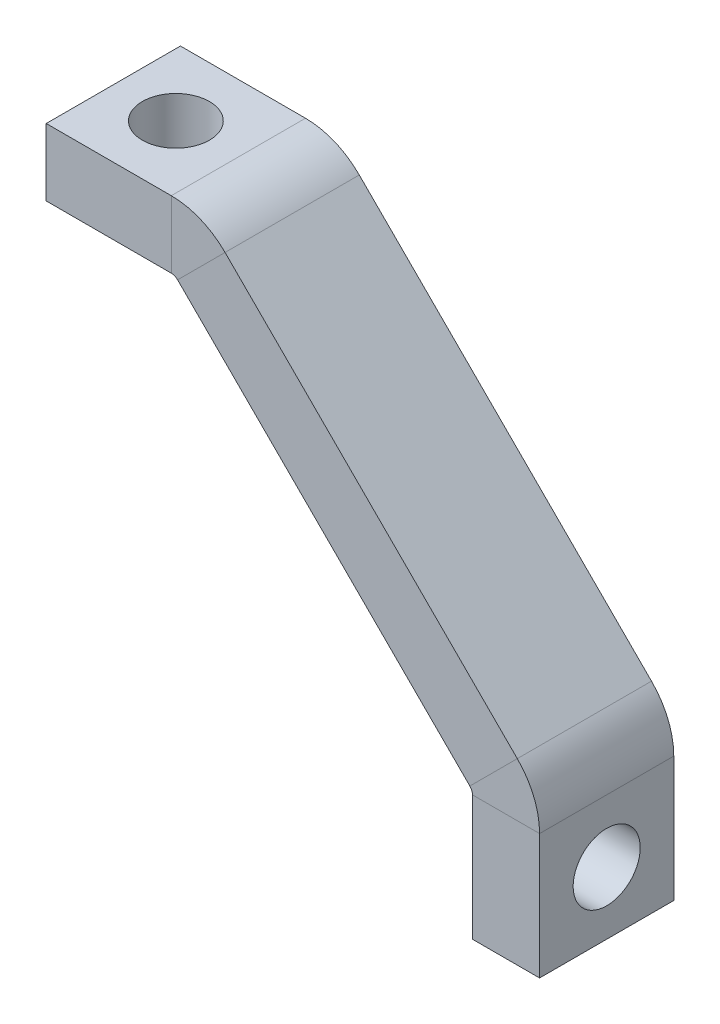
ISO-10303-21;
HEADER;
FILE_DESCRIPTION(('STEP AP214'),'2;1');
FILE_NAME('part.step','',(''),(''),'','','');
FILE_SCHEMA(('AUTOMOTIVE_DESIGN { 1 0 10303 214 1 1 1 1 }'));
ENDSEC;
DATA;
#1=APPLICATION_CONTEXT('core data for automotive mechanical design processes');
#2=APPLICATION_PROTOCOL_DEFINITION('international standard','automotive_design',2000,#1);
#3=PRODUCT_CONTEXT('',#1,'mechanical');
#4=PRODUCT('Part','Part','',(#3));
#5=PRODUCT_RELATED_PRODUCT_CATEGORY('part','',(#4));
#6=PRODUCT_DEFINITION_FORMATION('','',#4);
#7=PRODUCT_DEFINITION_CONTEXT('part definition',#1,'design');
#8=PRODUCT_DEFINITION('design','',#6,#7);
#9=PRODUCT_DEFINITION_SHAPE('','',#8);
#10=(LENGTH_UNIT() NAMED_UNIT(*) SI_UNIT(.MILLI.,.METRE.));
#11=(NAMED_UNIT(*) PLANE_ANGLE_UNIT() SI_UNIT($,.RADIAN.));
#12=(NAMED_UNIT(*) SI_UNIT($,.STERADIAN.) SOLID_ANGLE_UNIT());
#13=UNCERTAINTY_MEASURE_WITH_UNIT(LENGTH_MEASURE(1.E-05),#10,'distance_accuracy_value','');
#14=(GEOMETRIC_REPRESENTATION_CONTEXT(3) GLOBAL_UNCERTAINTY_ASSIGNED_CONTEXT((#13)) GLOBAL_UNIT_ASSIGNED_CONTEXT((#10,
#11,#12)) REPRESENTATION_CONTEXT('',''));
#15=CARTESIAN_POINT('',(0.,0.,0.));
#16=DIRECTION('',(0.,0.,1.));
#17=DIRECTION('',(1.,0.,0.));
#18=AXIS2_PLACEMENT_3D('',#15,#16,#17);
#19=CARTESIAN_POINT('',(-21.0835503941937,7.15158223835158,6.));
#20=DIRECTION('',(0.,0.,1.));
#21=DIRECTION('',(0.707106781186548,-0.707106781186547,0.));
#22=AXIS2_PLACEMENT_3D('',#19,#20,#21);
#23=PLANE('',#22);
#24=DIRECTION('',(-0.707106781186547,-0.707106781186548,0.));
#25=VECTOR('',#24,1.);
#26=CARTESIAN_POINT('',(-7.02147470229817,-6.91049345354399,6.));
#27=LINE('',#26,#25);
#28=CARTESIAN_POINT('',(-7.02147470229817,-6.91049345354399,6.));
#29=VERTEX_POINT('',#28);
#30=CARTESIAN_POINT('',(-9.14279504585781,-9.03181379710363,6.));
#31=VERTEX_POINT('',#30);
#32=EDGE_CURVE('E11',#29,#31,#27,.T.);
#33=ORIENTED_EDGE('',*,*,#32,.F.);
#34=DIRECTION('',(0.707106781186548,-0.707106781186547,0.));
#35=VECTOR('',#34,1.);
#36=CARTESIAN_POINT('',(-21.0835503941937,7.15158223835158,6.));
#37=LINE('',#36,#35);
#38=CARTESIAN_POINT('',(-20.087713450228,6.15574529438584,6.));
#39=VERTEX_POINT('',#38);
#40=EDGE_CURVE('E145',#39,#29,#37,.T.);
#41=ORIENTED_EDGE('',*,*,#40,.F.);
#42=DIRECTION('',(-0.707106781186547,-0.707106781186547,0.));
#43=VECTOR('',#42,1.);
#44=CARTESIAN_POINT('',(-20.087713450228,6.15574529438584,6.));
#45=LINE('',#44,#43);
#46=CARTESIAN_POINT('',(-22.2090337937876,4.0344249508262,6.));
#47=VERTEX_POINT('',#46);
#48=EDGE_CURVE('E49',#39,#47,#45,.T.);
#49=ORIENTED_EDGE('',*,*,#48,.T.);
#50=DIRECTION('',(-0.707106781186548,0.707106781186547,0.));
#51=VECTOR('',#50,1.);
#52=CARTESIAN_POINT('',(-23.2048707377534,5.03026189479194,6.));
#53=LINE('',#52,#51);
#54=EDGE_CURVE('E251',#47,#31,#53,.F.);
#55=ORIENTED_EDGE('',*,*,#54,.T.);
#56=EDGE_LOOP('',(#33,#41,#49,#55));
#57=FACE_BOUND('',#56,.T.);
#58=ADVANCED_FACE('F39',(#57),#23,.T.);
#59=CARTESIAN_POINT('',(-22.4918765062623,3.75158223835158,6.));
#60=DIRECTION('',(0.,0.,1.));
#61=DIRECTION('',(1.,0.,0.));
#62=AXIS2_PLACEMENT_3D('',#59,#60,#61);
#63=PLANE('',#62);
#64=ORIENTED_EDGE('',*,*,#48,.F.);
#65=CARTESIAN_POINT('',(-22.4918765062623,3.75158223835158,6.));
#66=DIRECTION('',(0.,0.,-1.));
#67=DIRECTION('',(-1.,0.,0.));
#68=AXIS2_PLACEMENT_3D('',#65,#66,#67);
#69=CIRCLE('',#68,3.4);
#70=CARTESIAN_POINT('',(-22.4918765062623,7.15158223835158,6.));
#71=VERTEX_POINT('',#70);
#72=EDGE_CURVE('E160',#39,#71,#69,.F.);
#73=ORIENTED_EDGE('',*,*,#72,.T.);
#74=DIRECTION('',(0.,-1.,0.));
#75=VECTOR('',#74,1.);
#76=CARTESIAN_POINT('',(-22.4918765062623,7.15158223835158,6.));
#77=LINE('',#76,#75);
#78=CARTESIAN_POINT('',(-22.4918765062623,4.15158223835158,6.));
#79=VERTEX_POINT('',#78);
#80=EDGE_CURVE('E211',#71,#79,#77,.T.);
#81=ORIENTED_EDGE('',*,*,#80,.T.);
#82=CARTESIAN_POINT('',(-22.4918765062623,3.75158223835158,6.));
#83=DIRECTION('',(0.,0.,1.));
#84=DIRECTION('',(1.,0.,0.));
#85=AXIS2_PLACEMENT_3D('',#82,#83,#84);
#86=CIRCLE('',#85,0.4);
#87=EDGE_CURVE('E252',#47,#79,#86,.T.);
#88=ORIENTED_EDGE('',*,*,#87,.F.);
#89=EDGE_LOOP('',(#64,#73,#81,#88));
#90=FACE_BOUND('',#89,.T.);
#91=ADVANCED_FACE('F298',(#90),#63,.T.);
#92=CARTESIAN_POINT('',(-28.0835503941937,7.15158223835158,6.));
#93=DIRECTION('',(0.,0.,1.));
#94=DIRECTION('',(1.,0.,0.));
#95=AXIS2_PLACEMENT_3D('',#92,#93,#94);
#96=PLANE('',#95);
#97=ORIENTED_EDGE('',*,*,#80,.F.);
#98=DIRECTION('',(1.,0.,0.));
#99=VECTOR('',#98,1.);
#100=CARTESIAN_POINT('',(-28.0835503941937,7.15158223835158,6.));
#101=LINE('',#100,#99);
#102=CARTESIAN_POINT('',(-28.0835503941937,7.15158223835158,6.));
#103=VERTEX_POINT('',#102);
#104=EDGE_CURVE('E173',#103,#71,#101,.T.);
#105=ORIENTED_EDGE('',*,*,#104,.F.);
#106=DIRECTION('',(0.,-1.,0.));
#107=VECTOR('',#106,1.);
#108=CARTESIAN_POINT('',(-28.0835503941937,7.15158223835158,6.));
#109=LINE('',#108,#107);
#110=CARTESIAN_POINT('',(-28.0835503941937,4.15158223835158,6.));
#111=VERTEX_POINT('',#110);
#112=EDGE_CURVE('E209',#103,#111,#109,.T.);
#113=ORIENTED_EDGE('',*,*,#112,.T.);
#114=DIRECTION('',(1.,0.,0.));
#115=VECTOR('',#114,1.);
#116=CARTESIAN_POINT('',(-28.0835503941937,4.15158223835158,6.));
#117=LINE('',#116,#115);
#118=EDGE_CURVE('E259',#111,#79,#117,.T.);
#119=ORIENTED_EDGE('',*,*,#118,.T.);
#120=EDGE_LOOP('',(#97,#105,#113,#119));
#121=FACE_BOUND('',#120,.T.);
#122=ADVANCED_FACE('F302',(#121),#96,.T.);
#123=CARTESIAN_POINT('',(-28.0835503941937,7.15158223835158,6.));
#124=DIRECTION('',(1.,0.,0.));
#125=DIRECTION('',(0.,0.,-1.));
#126=AXIS2_PLACEMENT_3D('',#123,#124,#125);
#127=PLANE('',#126);
#128=ORIENTED_EDGE('',*,*,#112,.F.);
#129=DIRECTION('',(0.,0.,-1.));
#130=VECTOR('',#129,1.);
#131=CARTESIAN_POINT('',(-28.0835503941937,7.15158223835158,6.));
#132=LINE('',#131,#130);
#133=CARTESIAN_POINT('',(-28.0835503941937,7.15158223835158,0.));
#134=VERTEX_POINT('',#133);
#135=EDGE_CURVE('E176',#103,#134,#132,.T.);
#136=ORIENTED_EDGE('',*,*,#135,.T.);
#137=DIRECTION('',(0.,-1.,0.));
#138=VECTOR('',#137,1.);
#139=CARTESIAN_POINT('',(-28.0835503941937,7.15158223835158,0.));
#140=LINE('',#139,#138);
#141=CARTESIAN_POINT('',(-28.0835503941937,4.15158223835158,0.));
#142=VERTEX_POINT('',#141);
#143=EDGE_CURVE('E207',#134,#142,#140,.T.);
#144=ORIENTED_EDGE('',*,*,#143,.T.);
#145=DIRECTION('',(0.,0.,1.));
#146=VECTOR('',#145,1.);
#147=CARTESIAN_POINT('',(-28.0835503941937,4.15158223835158,6.));
#148=LINE('',#147,#146);
#149=EDGE_CURVE('E247',#111,#142,#148,.F.);
#150=ORIENTED_EDGE('',*,*,#149,.F.);
#151=EDGE_LOOP('',(#128,#136,#144,#150));
#152=FACE_BOUND('',#151,.T.);
#153=ADVANCED_FACE('F308',(#152),#127,.F.);
#154=CARTESIAN_POINT('',(-28.0835503941937,7.15158223835158,0.));
#155=DIRECTION('',(0.,0.,1.));
#156=DIRECTION('',(1.,0.,0.));
#157=AXIS2_PLACEMENT_3D('',#154,#155,#156);
#158=PLANE('',#157);
#159=ORIENTED_EDGE('',*,*,#143,.F.);
#160=DIRECTION('',(1.,0.,0.));
#161=VECTOR('',#160,1.);
#162=CARTESIAN_POINT('',(-28.0835503941937,7.15158223835158,0.));
#163=LINE('',#162,#161);
#164=CARTESIAN_POINT('',(-22.4918765062623,7.15158223835158,0.));
#165=VERTEX_POINT('',#164);
#166=EDGE_CURVE('E162',#134,#165,#163,.T.);
#167=ORIENTED_EDGE('',*,*,#166,.T.);
#168=DIRECTION('',(0.,-1.,0.));
#169=VECTOR('',#168,1.);
#170=CARTESIAN_POINT('',(-22.4918765062623,7.15158223835158,0.));
#171=LINE('',#170,#169);
#172=CARTESIAN_POINT('',(-22.4918765062623,4.15158223835158,0.));
#173=VERTEX_POINT('',#172);
#174=EDGE_CURVE('E205',#165,#173,#171,.T.);
#175=ORIENTED_EDGE('',*,*,#174,.T.);
#176=DIRECTION('',(1.,0.,0.));
#177=VECTOR('',#176,1.);
#178=CARTESIAN_POINT('',(-28.0835503941937,4.15158223835158,0.));
#179=LINE('',#178,#177);
#180=EDGE_CURVE('E256',#142,#173,#179,.T.);
#181=ORIENTED_EDGE('',*,*,#180,.F.);
#182=EDGE_LOOP('',(#159,#167,#175,#181));
#183=FACE_BOUND('',#182,.T.);
#184=ADVANCED_FACE('F312',(#183),#158,.F.);
#185=CARTESIAN_POINT('',(-22.4918765062623,3.75158223835158,0.));
#186=DIRECTION('',(0.,0.,-1.));
#187=DIRECTION('',(-1.,0.,0.));
#188=AXIS2_PLACEMENT_3D('',#185,#186,#187);
#189=PLANE('',#188);
#190=ORIENTED_EDGE('',*,*,#174,.F.);
#191=CARTESIAN_POINT('',(-22.4918765062623,3.75158223835158,0.));
#192=DIRECTION('',(0.,0.,1.));
#193=DIRECTION('',(1.,0.,0.));
#194=AXIS2_PLACEMENT_3D('',#191,#192,#193);
#195=CIRCLE('',#194,3.4);
#196=CARTESIAN_POINT('',(-20.087713450228,6.15574529438584,0.));
#197=VERTEX_POINT('',#196);
#198=EDGE_CURVE('E165',#165,#197,#195,.F.);
#199=ORIENTED_EDGE('',*,*,#198,.T.);
#200=DIRECTION('',(-0.707106781186547,-0.707106781186548,0.));
#201=VECTOR('',#200,1.);
#202=CARTESIAN_POINT('',(-20.087713450228,6.15574529438584,0.));
#203=LINE('',#202,#201);
#204=CARTESIAN_POINT('',(-22.2090337937876,4.0344249508262,0.));
#205=VERTEX_POINT('',#204);
#206=EDGE_CURVE('E134',#197,#205,#203,.T.);
#207=ORIENTED_EDGE('',*,*,#206,.T.);
#208=CARTESIAN_POINT('',(-22.4918765062623,3.75158223835158,0.));
#209=DIRECTION('',(0.,0.,1.));
#210=DIRECTION('',(1.,0.,0.));
#211=AXIS2_PLACEMENT_3D('',#208,#209,#210);
#212=CIRCLE('',#211,0.4);
#213=EDGE_CURVE('E253',#173,#205,#212,.F.);
#214=ORIENTED_EDGE('',*,*,#213,.F.);
#215=EDGE_LOOP('',(#190,#199,#207,#214));
#216=FACE_BOUND('',#215,.T.);
#217=ADVANCED_FACE('F316',(#216),#189,.T.);
#218=CARTESIAN_POINT('',(-21.0835503941937,7.15158223835158,0.));
#219=DIRECTION('',(0.,0.,1.));
#220=DIRECTION('',(0.707106781186548,-0.707106781186547,0.));
#221=AXIS2_PLACEMENT_3D('',#218,#219,#220);
#222=PLANE('',#221);
#223=ORIENTED_EDGE('',*,*,#206,.F.);
#224=DIRECTION('',(0.707106781186548,-0.707106781186547,0.));
#225=VECTOR('',#224,1.);
#226=CARTESIAN_POINT('',(-21.0835503941937,7.15158223835158,0.));
#227=LINE('',#226,#225);
#228=CARTESIAN_POINT('',(-7.02147470229817,-6.91049345354399,0.));
#229=VERTEX_POINT('',#228);
#230=EDGE_CURVE('E143',#197,#229,#227,.T.);
#231=ORIENTED_EDGE('',*,*,#230,.T.);
#232=DIRECTION('',(-0.707106781186547,-0.707106781186547,0.));
#233=VECTOR('',#232,1.);
#234=CARTESIAN_POINT('',(-7.02147470229817,-6.91049345354399,0.));
#235=LINE('',#234,#233);
#236=CARTESIAN_POINT('',(-9.14279504585781,-9.03181379710363,0.));
#237=VERTEX_POINT('',#236);
#238=EDGE_CURVE('E58',#229,#237,#235,.T.);
#239=ORIENTED_EDGE('',*,*,#238,.T.);
#240=DIRECTION('',(-0.707106781186548,0.707106781186547,0.));
#241=VECTOR('',#240,1.);
#242=CARTESIAN_POINT('',(-23.2048707377534,5.03026189479194,0.));
#243=LINE('',#242,#241);
#244=EDGE_CURVE('E249',#205,#237,#243,.F.);
#245=ORIENTED_EDGE('',*,*,#244,.F.);
#246=EDGE_LOOP('',(#223,#231,#239,#245));
#247=FACE_BOUND('',#246,.T.);
#248=ADVANCED_FACE('F158',(#247),#222,.F.);
#249=CARTESIAN_POINT('',(-9.42563775833243,-9.31465650957825,0.));
#250=DIRECTION('',(0.,0.,-1.));
#251=DIRECTION('',(-1.,0.,0.));
#252=AXIS2_PLACEMENT_3D('',#249,#250,#251);
#253=PLANE('',#252);
#254=ORIENTED_EDGE('',*,*,#238,.F.);
#255=CARTESIAN_POINT('',(-9.42563775833243,-9.31465650957825,0.));
#256=DIRECTION('',(0.,0.,1.));
#257=DIRECTION('',(1.,0.,0.));
#258=AXIS2_PLACEMENT_3D('',#255,#256,#257);
#259=CIRCLE('',#258,3.4);
#260=CARTESIAN_POINT('',(-6.02563775833243,-9.31465650957825,0.));
#261=VERTEX_POINT('',#260);
#262=EDGE_CURVE('E130',#229,#261,#259,.F.);
#263=ORIENTED_EDGE('',*,*,#262,.T.);
#264=DIRECTION('',(-1.,0.,0.));
#265=VECTOR('',#264,1.);
#266=CARTESIAN_POINT('',(-6.02563775833243,-9.31465650957825,0.));
#267=LINE('',#266,#265);
#268=CARTESIAN_POINT('',(-9.02563775833243,-9.31465650957825,0.));
#269=VERTEX_POINT('',#268);
#270=EDGE_CURVE('E135',#261,#269,#267,.T.);
#271=ORIENTED_EDGE('',*,*,#270,.T.);
#272=CARTESIAN_POINT('',(-9.42563775833243,-9.31465650957825,0.));
#273=DIRECTION('',(0.,0.,1.));
#274=DIRECTION('',(1.,0.,0.));
#275=AXIS2_PLACEMENT_3D('',#272,#273,#274);
#276=CIRCLE('',#275,0.4);
#277=EDGE_CURVE('E132',#237,#269,#276,.F.);
#278=ORIENTED_EDGE('',*,*,#277,.F.);
#279=EDGE_LOOP('',(#254,#263,#271,#278));
#280=FACE_BOUND('',#279,.T.);
#281=ADVANCED_FACE('F127',(#280),#253,.T.);
#282=CARTESIAN_POINT('',(-6.02563775833243,-7.90633039750973,0.));
#283=DIRECTION('',(0.,0.,1.));
#284=DIRECTION('',(0.,-1.,0.));
#285=AXIS2_PLACEMENT_3D('',#282,#283,#284);
#286=PLANE('',#285);
#287=ORIENTED_EDGE('',*,*,#270,.F.);
#288=DIRECTION('',(0.,-1.,0.));
#289=VECTOR('',#288,1.);
#290=CARTESIAN_POINT('',(-6.02563775833243,-7.90633039750973,0.));
#291=LINE('',#290,#289);
#292=CARTESIAN_POINT('',(-6.02563775833243,-14.9063303975097,0.));
#293=VERTEX_POINT('',#292);
#294=EDGE_CURVE('E179',#261,#293,#291,.T.);
#295=ORIENTED_EDGE('',*,*,#294,.T.);
#296=DIRECTION('',(-1.,0.,0.));
#297=VECTOR('',#296,1.);
#298=CARTESIAN_POINT('',(-6.02563775833243,-14.9063303975097,0.));
#299=LINE('',#298,#297);
#300=CARTESIAN_POINT('',(-9.02563775833243,-14.9063303975097,0.));
#301=VERTEX_POINT('',#300);
#302=EDGE_CURVE('E199',#293,#301,#299,.T.);
#303=ORIENTED_EDGE('',*,*,#302,.T.);
#304=DIRECTION('',(0.,1.,0.));
#305=VECTOR('',#304,1.);
#306=CARTESIAN_POINT('',(-9.02563775833243,-7.90633039750973,0.));
#307=LINE('',#306,#305);
#308=EDGE_CURVE('E244',#269,#301,#307,.F.);
#309=ORIENTED_EDGE('',*,*,#308,.F.);
#310=EDGE_LOOP('',(#287,#295,#303,#309));
#311=FACE_BOUND('',#310,.T.);
#312=ADVANCED_FACE('F287',(#311),#286,.F.);
#313=CARTESIAN_POINT('',(-6.02563775833243,-14.9063303975097,6.));
#314=DIRECTION('',(0.,-1.,0.));
#315=DIRECTION('',(0.,0.,-1.));
#316=AXIS2_PLACEMENT_3D('',#313,#314,#315);
#317=PLANE('',#316);
#318=ORIENTED_EDGE('',*,*,#302,.F.);
#319=DIRECTION('',(0.,0.,-1.));
#320=VECTOR('',#319,1.);
#321=CARTESIAN_POINT('',(-6.02563775833243,-14.9063303975097,6.));
#322=LINE('',#321,#320);
#323=CARTESIAN_POINT('',(-6.02563775833243,-14.9063303975097,6.));
#324=VERTEX_POINT('',#323);
#325=EDGE_CURVE('E182',#324,#293,#322,.T.);
#326=ORIENTED_EDGE('',*,*,#325,.F.);
#327=DIRECTION('',(-1.,0.,0.));
#328=VECTOR('',#327,1.);
#329=CARTESIAN_POINT('',(-6.02563775833243,-14.9063303975097,6.));
#330=LINE('',#329,#328);
#331=CARTESIAN_POINT('',(-9.02563775833243,-14.9063303975097,6.));
#332=VERTEX_POINT('',#331);
#333=EDGE_CURVE('E196',#324,#332,#330,.T.);
#334=ORIENTED_EDGE('',*,*,#333,.T.);
#335=DIRECTION('',(0.,0.,-1.));
#336=VECTOR('',#335,1.);
#337=CARTESIAN_POINT('',(-9.02563775833243,-14.9063303975097,6.));
#338=LINE('',#337,#336);
#339=EDGE_CURVE('E241',#332,#301,#338,.T.);
#340=ORIENTED_EDGE('',*,*,#339,.T.);
#341=EDGE_LOOP('',(#318,#326,#334,#340));
#342=FACE_BOUND('',#341,.T.);
#343=ADVANCED_FACE('F288',(#342),#317,.T.);
#344=CARTESIAN_POINT('',(-6.02563775833243,-7.90633039750973,6.));
#345=DIRECTION('',(0.,0.,1.));
#346=DIRECTION('',(0.,-1.,0.));
#347=AXIS2_PLACEMENT_3D('',#344,#345,#346);
#348=PLANE('',#347);
#349=ORIENTED_EDGE('',*,*,#333,.F.);
#350=DIRECTION('',(0.,-1.,0.));
#351=VECTOR('',#350,1.);
#352=CARTESIAN_POINT('',(-6.02563775833243,-7.90633039750973,6.));
#353=LINE('',#352,#351);
#354=CARTESIAN_POINT('',(-6.02563775833243,-9.31465650957825,6.));
#355=VERTEX_POINT('',#354);
#356=EDGE_CURVE('E185',#355,#324,#353,.T.);
#357=ORIENTED_EDGE('',*,*,#356,.F.);
#358=DIRECTION('',(-1.,0.,0.));
#359=VECTOR('',#358,1.);
#360=CARTESIAN_POINT('',(-6.02563775833243,-9.31465650957825,6.));
#361=LINE('',#360,#359);
#362=CARTESIAN_POINT('',(-9.02563775833243,-9.31465650957825,6.));
#363=VERTEX_POINT('',#362);
#364=EDGE_CURVE('E200',#355,#363,#361,.T.);
#365=ORIENTED_EDGE('',*,*,#364,.T.);
#366=DIRECTION('',(0.,1.,0.));
#367=VECTOR('',#366,1.);
#368=CARTESIAN_POINT('',(-9.02563775833243,-7.90633039750973,6.));
#369=LINE('',#368,#367);
#370=EDGE_CURVE('E236',#363,#332,#369,.F.);
#371=ORIENTED_EDGE('',*,*,#370,.T.);
#372=EDGE_LOOP('',(#349,#357,#365,#371));
#373=FACE_BOUND('',#372,.T.);
#374=ADVANCED_FACE('F281',(#373),#348,.T.);
#375=CARTESIAN_POINT('',(-9.42563775833243,-9.31465650957825,6.));
#376=DIRECTION('',(0.,0.,1.));
#377=DIRECTION('',(1.,0.,0.));
#378=AXIS2_PLACEMENT_3D('',#375,#376,#377);
#379=PLANE('',#378);
#380=CARTESIAN_POINT('',(-9.42563775833243,-9.31465650957825,6.));
#381=DIRECTION('',(0.,0.,-1.));
#382=DIRECTION('',(-1.,0.,0.));
#383=AXIS2_PLACEMENT_3D('',#380,#381,#382);
#384=CIRCLE('',#383,3.4);
#385=EDGE_CURVE('E155',#355,#29,#384,.F.);
#386=ORIENTED_EDGE('',*,*,#385,.T.);
#387=ORIENTED_EDGE('',*,*,#32,.T.);
#388=CARTESIAN_POINT('',(-9.42563775833243,-9.31465650957825,6.));
#389=DIRECTION('',(0.,0.,1.));
#390=DIRECTION('',(1.,0.,0.));
#391=AXIS2_PLACEMENT_3D('',#388,#389,#390);
#392=CIRCLE('',#391,0.4);
#393=EDGE_CURVE('E168',#363,#31,#392,.T.);
#394=ORIENTED_EDGE('',*,*,#393,.F.);
#395=ORIENTED_EDGE('',*,*,#364,.F.);
#396=EDGE_LOOP('',(#386,#387,#394,#395));
#397=FACE_BOUND('',#396,.T.);
#398=ADVANCED_FACE('F41',(#397),#379,.T.);
#399=CARTESIAN_POINT('',(-9.02563775833243,-7.90633039750973,6.));
#400=DIRECTION('',(1.,0.,0.));
#401=DIRECTION('',(0.,0.,-1.));
#402=AXIS2_PLACEMENT_3D('',#399,#400,#401);
#403=PLANE('',#402);
#404=CARTESIAN_POINT('',(-9.02563775833243,-12.110493453544,3.));
#405=DIRECTION('',(-1.,0.,0.));
#406=DIRECTION('',(0.,0.,1.));
#407=AXIS2_PLACEMENT_3D('',#404,#405,#406);
#408=CIRCLE('',#407,1.5);
#409=CARTESIAN_POINT('',(-9.02563775833243,-12.110493453544,4.5));
#410=VERTEX_POINT('',#409);
#411=EDGE_CURVE('E224',#410,#410,#408,.T.);
#412=ORIENTED_EDGE('',*,*,#411,.F.);
#413=EDGE_LOOP('',(#412));
#414=FACE_BOUND('',#413,.T.);
#415=ORIENTED_EDGE('',*,*,#370,.F.);
#416=DIRECTION('',(0.,0.,-1.));
#417=VECTOR('',#416,1.);
#418=CARTESIAN_POINT('',(-9.02563775833243,-9.31465650957825,6.));
#419=LINE('',#418,#417);
#420=EDGE_CURVE('E227',#363,#269,#419,.T.);
#421=ORIENTED_EDGE('',*,*,#420,.T.);
#422=ORIENTED_EDGE('',*,*,#308,.T.);
#423=ORIENTED_EDGE('',*,*,#339,.F.);
#424=EDGE_LOOP('',(#415,#421,#422,#423));
#425=FACE_BOUND('',#424,.T.);
#426=ADVANCED_FACE('F279',(#414,#425),#403,.F.);
#427=CARTESIAN_POINT('',(-28.0835503941937,4.15158223835158,6.));
#428=DIRECTION('',(0.,1.,0.));
#429=DIRECTION('',(0.,0.,1.));
#430=AXIS2_PLACEMENT_3D('',#427,#428,#429);
#431=PLANE('',#430);
#432=CARTESIAN_POINT('',(-25.287713450228,4.15158223835157,3.));
#433=DIRECTION('',(0.,-1.,0.));
#434=DIRECTION('',(1.,0.,0.));
#435=AXIS2_PLACEMENT_3D('',#432,#433,#434);
#436=CIRCLE('',#435,1.5);
#437=CARTESIAN_POINT('',(-23.787713450228,4.15158223835157,3.));
#438=VERTEX_POINT('',#437);
#439=EDGE_CURVE('E216',#438,#438,#436,.T.);
#440=ORIENTED_EDGE('',*,*,#439,.F.);
#441=EDGE_LOOP('',(#440));
#442=FACE_BOUND('',#441,.T.);
#443=ORIENTED_EDGE('',*,*,#180,.T.);
#444=DIRECTION('',(0.,0.,1.));
#445=VECTOR('',#444,1.);
#446=CARTESIAN_POINT('',(-22.4918765062623,4.15158223835158,6.));
#447=LINE('',#446,#445);
#448=EDGE_CURVE('E230',#173,#79,#447,.T.);
#449=ORIENTED_EDGE('',*,*,#448,.T.);
#450=ORIENTED_EDGE('',*,*,#118,.F.);
#451=ORIENTED_EDGE('',*,*,#149,.T.);
#452=EDGE_LOOP('',(#443,#449,#450,#451));
#453=FACE_BOUND('',#452,.T.);
#454=ADVANCED_FACE('F365',(#442,#453),#431,.F.);
#455=CARTESIAN_POINT('',(-23.2048707377534,5.03026189479194,6.));
#456=DIRECTION('',(0.707106781186547,0.707106781186548,0.));
#457=DIRECTION('',(-0.707106781186548,0.707106781186547,0.));
#458=AXIS2_PLACEMENT_3D('',#455,#456,#457);
#459=PLANE('',#458);
#460=ORIENTED_EDGE('',*,*,#244,.T.);
#461=DIRECTION('',(0.,0.,1.));
#462=VECTOR('',#461,1.);
#463=CARTESIAN_POINT('',(-9.14279504585781,-9.03181379710363,6.));
#464=LINE('',#463,#462);
#465=EDGE_CURVE('E214',#237,#31,#464,.T.);
#466=ORIENTED_EDGE('',*,*,#465,.T.);
#467=ORIENTED_EDGE('',*,*,#54,.F.);
#468=DIRECTION('',(0.,0.,1.));
#469=VECTOR('',#468,1.);
#470=CARTESIAN_POINT('',(-22.2090337937876,4.0344249508262,6.));
#471=LINE('',#470,#469);
#472=EDGE_CURVE('E233',#47,#205,#471,.F.);
#473=ORIENTED_EDGE('',*,*,#472,.T.);
#474=EDGE_LOOP('',(#460,#466,#467,#473));
#475=FACE_BOUND('',#474,.T.);
#476=ADVANCED_FACE('F268',(#475),#459,.F.);
#477=CARTESIAN_POINT('',(-22.4918765062623,3.75158223835158,6.));
#478=DIRECTION('',(0.,0.,1.));
#479=DIRECTION('',(1.,0.,0.));
#480=AXIS2_PLACEMENT_3D('',#477,#478,#479);
#481=CYLINDRICAL_SURFACE('',#480,0.4);
#482=ORIENTED_EDGE('',*,*,#87,.T.);
#483=ORIENTED_EDGE('',*,*,#448,.F.);
#484=ORIENTED_EDGE('',*,*,#213,.T.);
#485=ORIENTED_EDGE('',*,*,#472,.F.);
#486=EDGE_LOOP('',(#482,#483,#484,#485));
#487=FACE_BOUND('',#486,.T.);
#488=ADVANCED_FACE('F364',(#487),#481,.F.);
#489=CARTESIAN_POINT('',(-9.42563775833243,-9.31465650957825,6.));
#490=DIRECTION('',(0.,0.,1.));
#491=DIRECTION('',(1.,0.,0.));
#492=AXIS2_PLACEMENT_3D('',#489,#490,#491);
#493=CYLINDRICAL_SURFACE('',#492,0.4);
#494=ORIENTED_EDGE('',*,*,#393,.T.);
#495=ORIENTED_EDGE('',*,*,#465,.F.);
#496=ORIENTED_EDGE('',*,*,#277,.T.);
#497=ORIENTED_EDGE('',*,*,#420,.F.);
#498=EDGE_LOOP('',(#494,#495,#496,#497));
#499=FACE_BOUND('',#498,.T.);
#500=ADVANCED_FACE('F271',(#499),#493,.F.);
#501=CARTESIAN_POINT('',(-6.02563775833243,-7.90633039750973,6.));
#502=DIRECTION('',(1.,0.,0.));
#503=DIRECTION('',(0.,0.,-1.));
#504=AXIS2_PLACEMENT_3D('',#501,#502,#503);
#505=PLANE('',#504);
#506=CARTESIAN_POINT('',(-6.02563775833243,-12.110493453544,3.));
#507=DIRECTION('',(1.,0.,0.));
#508=DIRECTION('',(0.,0.,-1.));
#509=AXIS2_PLACEMENT_3D('',#506,#507,#508);
#510=CIRCLE('',#509,1.5);
#511=CARTESIAN_POINT('',(-6.02563775833243,-12.110493453544,1.5));
#512=VERTEX_POINT('',#511);
#513=EDGE_CURVE('E43',#512,#512,#510,.T.);
#514=ORIENTED_EDGE('',*,*,#513,.F.);
#515=EDGE_LOOP('',(#514));
#516=FACE_BOUND('',#515,.T.);
#517=ORIENTED_EDGE('',*,*,#356,.T.);
#518=ORIENTED_EDGE('',*,*,#325,.T.);
#519=ORIENTED_EDGE('',*,*,#294,.F.);
#520=DIRECTION('',(0.,0.,-1.));
#521=VECTOR('',#520,1.);
#522=CARTESIAN_POINT('',(-6.02563775833243,-9.31465650957825,0.));
#523=LINE('',#522,#521);
#524=EDGE_CURVE('E149',#355,#261,#523,.T.);
#525=ORIENTED_EDGE('',*,*,#524,.F.);
#526=EDGE_LOOP('',(#517,#518,#519,#525));
#527=FACE_BOUND('',#526,.T.);
#528=ADVANCED_FACE('F387',(#516,#527),#505,.T.);
#529=CARTESIAN_POINT('',(-28.0835503941937,7.15158223835158,6.));
#530=DIRECTION('',(0.,1.,0.));
#531=DIRECTION('',(0.,0.,1.));
#532=AXIS2_PLACEMENT_3D('',#529,#530,#531);
#533=PLANE('',#532);
#534=CARTESIAN_POINT('',(-25.287713450228,7.15158223835158,3.));
#535=DIRECTION('',(0.,1.,0.));
#536=DIRECTION('',(0.,0.,1.));
#537=AXIS2_PLACEMENT_3D('',#534,#535,#536);
#538=CIRCLE('',#537,1.5);
#539=CARTESIAN_POINT('',(-25.287713450228,7.15158223835158,4.5));
#540=VERTEX_POINT('',#539);
#541=EDGE_CURVE('E156',#540,#540,#538,.T.);
#542=ORIENTED_EDGE('',*,*,#541,.F.);
#543=EDGE_LOOP('',(#542));
#544=FACE_BOUND('',#543,.T.);
#545=ORIENTED_EDGE('',*,*,#166,.F.);
#546=ORIENTED_EDGE('',*,*,#135,.F.);
#547=ORIENTED_EDGE('',*,*,#104,.T.);
#548=DIRECTION('',(0.,0.,-1.));
#549=VECTOR('',#548,1.);
#550=CARTESIAN_POINT('',(-22.4918765062623,7.15158223835158,6.));
#551=LINE('',#550,#549);
#552=EDGE_CURVE('E190',#165,#71,#551,.F.);
#553=ORIENTED_EDGE('',*,*,#552,.F.);
#554=EDGE_LOOP('',(#545,#546,#547,#553));
#555=FACE_BOUND('',#554,.T.);
#556=ADVANCED_FACE('F400',(#544,#555),#533,.T.);
#557=CARTESIAN_POINT('',(-21.0835503941937,7.15158223835158,6.));
#558=DIRECTION('',(0.707106781186547,0.707106781186548,0.));
#559=DIRECTION('',(-0.707106781186548,0.707106781186547,0.));
#560=AXIS2_PLACEMENT_3D('',#557,#558,#559);
#561=PLANE('',#560);
#562=ORIENTED_EDGE('',*,*,#230,.F.);
#563=DIRECTION('',(0.,0.,-1.));
#564=VECTOR('',#563,1.);
#565=CARTESIAN_POINT('',(-20.087713450228,6.15574529438584,0.));
#566=LINE('',#565,#564);
#567=EDGE_CURVE('E188',#39,#197,#566,.T.);
#568=ORIENTED_EDGE('',*,*,#567,.F.);
#569=ORIENTED_EDGE('',*,*,#40,.T.);
#570=DIRECTION('',(0.,0.,-1.));
#571=VECTOR('',#570,1.);
#572=CARTESIAN_POINT('',(-7.02147470229817,-6.91049345354399,6.));
#573=LINE('',#572,#571);
#574=EDGE_CURVE('E140',#229,#29,#573,.F.);
#575=ORIENTED_EDGE('',*,*,#574,.F.);
#576=EDGE_LOOP('',(#562,#568,#569,#575));
#577=FACE_BOUND('',#576,.T.);
#578=ADVANCED_FACE('F141',(#577),#561,.T.);
#579=CARTESIAN_POINT('',(-22.4918765062623,3.75158223835158,6.));
#580=DIRECTION('',(0.,0.,1.));
#581=DIRECTION('',(1.,0.,0.));
#582=AXIS2_PLACEMENT_3D('',#579,#580,#581);
#583=CYLINDRICAL_SURFACE('',#582,3.4);
#584=ORIENTED_EDGE('',*,*,#72,.F.);
#585=ORIENTED_EDGE('',*,*,#567,.T.);
#586=ORIENTED_EDGE('',*,*,#198,.F.);
#587=ORIENTED_EDGE('',*,*,#552,.T.);
#588=EDGE_LOOP('',(#584,#585,#586,#587));
#589=FACE_BOUND('',#588,.T.);
#590=ADVANCED_FACE('F399',(#589),#583,.T.);
#591=CARTESIAN_POINT('',(-9.42563775833243,-9.31465650957825,6.));
#592=DIRECTION('',(0.,0.,1.));
#593=DIRECTION('',(1.,0.,0.));
#594=AXIS2_PLACEMENT_3D('',#591,#592,#593);
#595=CYLINDRICAL_SURFACE('',#594,3.4);
#596=ORIENTED_EDGE('',*,*,#385,.F.);
#597=ORIENTED_EDGE('',*,*,#524,.T.);
#598=ORIENTED_EDGE('',*,*,#262,.F.);
#599=ORIENTED_EDGE('',*,*,#574,.T.);
#600=EDGE_LOOP('',(#596,#597,#598,#599));
#601=FACE_BOUND('',#600,.T.);
#602=ADVANCED_FACE('F152',(#601),#595,.T.);
#603=CARTESIAN_POINT('',(-25.287713450228,12.1515822383516,3.));
#604=DIRECTION('',(0.,-1.,0.));
#605=DIRECTION('',(1.,0.,0.));
#606=AXIS2_PLACEMENT_3D('',#603,#604,#605);
#607=CYLINDRICAL_SURFACE('',#606,1.5);
#608=ORIENTED_EDGE('',*,*,#541,.T.);
#609=EDGE_LOOP('',(#608));
#610=FACE_BOUND('',#609,.T.);
#611=ORIENTED_EDGE('',*,*,#439,.T.);
#612=EDGE_LOOP('',(#611));
#613=FACE_BOUND('',#612,.T.);
#614=ADVANCED_FACE('F422',(#610,#613),#607,.F.);
#615=CARTESIAN_POINT('',(-1.02563775833243,-12.110493453544,3.));
#616=DIRECTION('',(-1.,0.,0.));
#617=DIRECTION('',(0.,0.,1.));
#618=AXIS2_PLACEMENT_3D('',#615,#616,#617);
#619=CYLINDRICAL_SURFACE('',#618,1.5);
#620=ORIENTED_EDGE('',*,*,#513,.T.);
#621=EDGE_LOOP('',(#620));
#622=FACE_BOUND('',#621,.T.);
#623=ORIENTED_EDGE('',*,*,#411,.T.);
#624=EDGE_LOOP('',(#623));
#625=FACE_BOUND('',#624,.T.);
#626=ADVANCED_FACE('F448',(#622,#625),#619,.F.);
#627=CLOSED_SHELL('',(#58,#91,#122,#153,#184,#217,#248,#281,#312,#343,#374,#398,#426,#454,#476,
#488,#500,#528,#556,#578,#590,#602,#614,#626));
#628=MANIFOLD_SOLID_BREP('B2',#627);
#629=ADVANCED_BREP_SHAPE_REPRESENTATION('',(#18,#628),#14);
#630=SHAPE_DEFINITION_REPRESENTATION(#9,#629);
ENDSEC;
END-ISO-10303-21;
